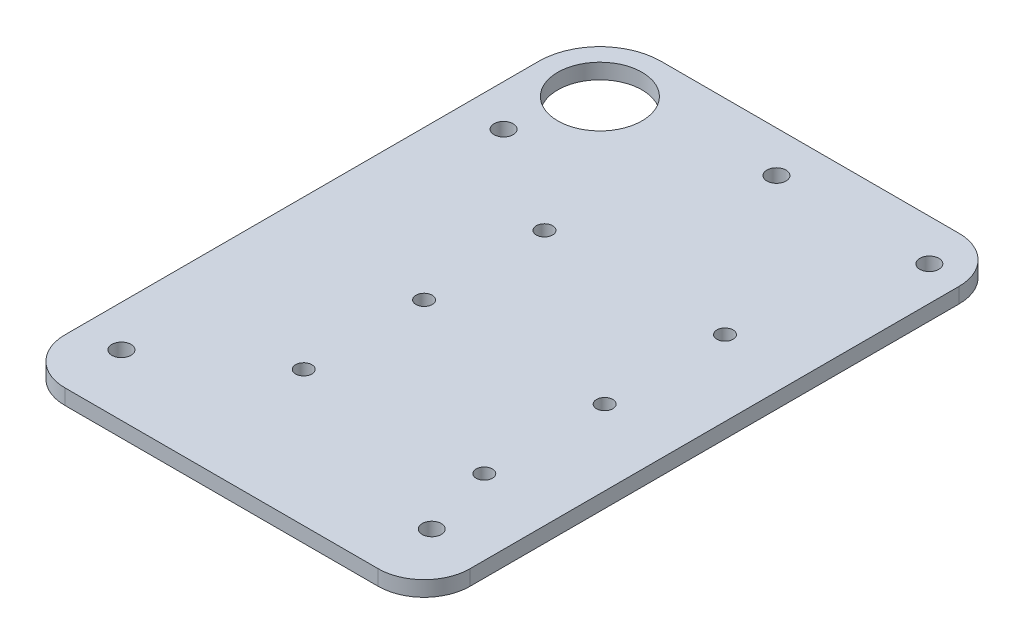
ISO-10303-21;
HEADER;
FILE_DESCRIPTION(('STEP AP214'),'2;1');
FILE_NAME('part.step','',(''),(''),'','','');
FILE_SCHEMA(('AUTOMOTIVE_DESIGN { 1 0 10303 214 1 1 1 1 }'));
ENDSEC;
DATA;
#1=APPLICATION_CONTEXT('core data for automotive mechanical design processes');
#2=APPLICATION_PROTOCOL_DEFINITION('international standard','automotive_design',2000,#1);
#3=PRODUCT_CONTEXT('',#1,'mechanical');
#4=PRODUCT('Part','Part','',(#3));
#5=PRODUCT_RELATED_PRODUCT_CATEGORY('part','',(#4));
#6=PRODUCT_DEFINITION_FORMATION('','',#4);
#7=PRODUCT_DEFINITION_CONTEXT('part definition',#1,'design');
#8=PRODUCT_DEFINITION('design','',#6,#7);
#9=PRODUCT_DEFINITION_SHAPE('','',#8);
#10=(LENGTH_UNIT() NAMED_UNIT(*) SI_UNIT(.MILLI.,.METRE.));
#11=(NAMED_UNIT(*) PLANE_ANGLE_UNIT() SI_UNIT($,.RADIAN.));
#12=(NAMED_UNIT(*) SI_UNIT($,.STERADIAN.) SOLID_ANGLE_UNIT());
#13=UNCERTAINTY_MEASURE_WITH_UNIT(LENGTH_MEASURE(1.E-05),#10,'distance_accuracy_value','');
#14=(GEOMETRIC_REPRESENTATION_CONTEXT(3) GLOBAL_UNCERTAINTY_ASSIGNED_CONTEXT((#13)) GLOBAL_UNIT_ASSIGNED_CONTEXT((#10,
#11,#12)) REPRESENTATION_CONTEXT('',''));
#15=CARTESIAN_POINT('',(0.,0.,0.));
#16=DIRECTION('',(0.,0.,1.));
#17=DIRECTION('',(1.,0.,0.));
#18=AXIS2_PLACEMENT_3D('',#15,#16,#17);
#19=CARTESIAN_POINT('',(0.,5.08,0.));
#20=DIRECTION('',(0.,-1.,0.));
#21=DIRECTION('',(0.,0.,-1.));
#22=AXIS2_PLACEMENT_3D('',#19,#20,#21);
#23=CYLINDRICAL_SURFACE('',#22,20.32);
#24=CARTESIAN_POINT('',(0.,0.,0.));
#25=DIRECTION('',(0.,1.,0.));
#26=DIRECTION('',(0.,0.,1.));
#27=AXIS2_PLACEMENT_3D('',#24,#25,#26);
#28=CIRCLE('',#27,20.32);
#29=CARTESIAN_POINT('',(0.,0.,-20.32));
#30=VERTEX_POINT('',#29);
#31=CARTESIAN_POINT('',(-20.32,0.,0.));
#32=VERTEX_POINT('',#31);
#33=EDGE_CURVE('E129',#30,#32,#28,.T.);
#34=ORIENTED_EDGE('',*,*,#33,.T.);
#35=DIRECTION('',(0.,-1.,0.));
#36=VECTOR('',#35,1.);
#37=CARTESIAN_POINT('',(-20.32,5.08,0.));
#38=LINE('',#37,#36);
#39=CARTESIAN_POINT('',(-20.32,5.08,0.));
#40=VERTEX_POINT('',#39);
#41=EDGE_CURVE('E112',#40,#32,#38,.T.);
#42=ORIENTED_EDGE('',*,*,#41,.F.);
#43=CARTESIAN_POINT('',(0.,5.08,0.));
#44=DIRECTION('',(0.,1.,0.));
#45=DIRECTION('',(0.,0.,1.));
#46=AXIS2_PLACEMENT_3D('',#43,#44,#45);
#47=CIRCLE('',#46,20.32);
#48=CARTESIAN_POINT('',(0.,5.08,-20.32));
#49=VERTEX_POINT('',#48);
#50=EDGE_CURVE('E116',#49,#40,#47,.T.);
#51=ORIENTED_EDGE('',*,*,#50,.F.);
#52=DIRECTION('',(0.,-1.,0.));
#53=VECTOR('',#52,1.);
#54=CARTESIAN_POINT('',(0.,5.08,-20.32));
#55=LINE('',#54,#53);
#56=EDGE_CURVE('E131',#49,#30,#55,.T.);
#57=ORIENTED_EDGE('',*,*,#56,.T.);
#58=EDGE_LOOP('',(#34,#42,#51,#57));
#59=FACE_BOUND('',#58,.T.);
#60=ADVANCED_FACE('F43',(#59),#23,.T.);
#61=CARTESIAN_POINT('',(-20.32,5.08,0.));
#62=DIRECTION('',(1.,0.,0.));
#63=DIRECTION('',(0.,0.,-1.));
#64=AXIS2_PLACEMENT_3D('',#61,#62,#63);
#65=PLANE('',#64);
#66=DIRECTION('',(0.,0.,1.));
#67=VECTOR('',#66,1.);
#68=CARTESIAN_POINT('',(-20.32,0.,0.));
#69=LINE('',#68,#67);
#70=CARTESIAN_POINT('',(-20.32,0.,157.48));
#71=VERTEX_POINT('',#70);
#72=EDGE_CURVE('E168',#32,#71,#69,.T.);
#73=ORIENTED_EDGE('',*,*,#72,.T.);
#74=DIRECTION('',(0.,-1.,0.));
#75=VECTOR('',#74,1.);
#76=CARTESIAN_POINT('',(-20.32,5.08,157.48));
#77=LINE('',#76,#75);
#78=CARTESIAN_POINT('',(-20.32,5.08,157.48));
#79=VERTEX_POINT('',#78);
#80=EDGE_CURVE('E11',#71,#79,#77,.F.);
#81=ORIENTED_EDGE('',*,*,#80,.T.);
#82=DIRECTION('',(0.,0.,1.));
#83=VECTOR('',#82,1.);
#84=CARTESIAN_POINT('',(-20.32,5.08,0.));
#85=LINE('',#84,#83);
#86=EDGE_CURVE('E107',#40,#79,#85,.T.);
#87=ORIENTED_EDGE('',*,*,#86,.F.);
#88=ORIENTED_EDGE('',*,*,#41,.T.);
#89=EDGE_LOOP('',(#73,#81,#87,#88));
#90=FACE_BOUND('',#89,.T.);
#91=ADVANCED_FACE('F110',(#90),#65,.F.);
#92=CARTESIAN_POINT('',(0.,5.08,172.72));
#93=DIRECTION('',(0.,0.,-1.));
#94=DIRECTION('',(-1.,0.,0.));
#95=AXIS2_PLACEMENT_3D('',#92,#93,#94);
#96=PLANE('',#95);
#97=DIRECTION('',(1.,0.,0.));
#98=VECTOR('',#97,1.);
#99=CARTESIAN_POINT('',(0.,0.,172.72));
#100=LINE('',#99,#98);
#101=CARTESIAN_POINT('',(-5.07999999999998,0.,172.72));
#102=VERTEX_POINT('',#101);
#103=CARTESIAN_POINT('',(99.06,0.,172.72));
#104=VERTEX_POINT('',#103);
#105=EDGE_CURVE('E160',#102,#104,#100,.T.);
#106=ORIENTED_EDGE('',*,*,#105,.T.);
#107=DIRECTION('',(0.,-1.,0.));
#108=VECTOR('',#107,1.);
#109=CARTESIAN_POINT('',(99.06,5.08,172.72));
#110=LINE('',#109,#108);
#111=CARTESIAN_POINT('',(99.06,5.08,172.72));
#112=VERTEX_POINT('',#111);
#113=EDGE_CURVE('E51',#104,#112,#110,.F.);
#114=ORIENTED_EDGE('',*,*,#113,.T.);
#115=DIRECTION('',(1.,0.,0.));
#116=VECTOR('',#115,1.);
#117=CARTESIAN_POINT('',(0.,5.08,172.72));
#118=LINE('',#117,#116);
#119=CARTESIAN_POINT('',(-5.07999999999998,5.08,172.72));
#120=VERTEX_POINT('',#119);
#121=EDGE_CURVE('E115',#120,#112,#118,.T.);
#122=ORIENTED_EDGE('',*,*,#121,.F.);
#123=DIRECTION('',(0.,-1.,0.));
#124=VECTOR('',#123,1.);
#125=CARTESIAN_POINT('',(-5.07999999999998,5.08,172.72));
#126=LINE('',#125,#124);
#127=EDGE_CURVE('E155',#120,#102,#126,.T.);
#128=ORIENTED_EDGE('',*,*,#127,.T.);
#129=EDGE_LOOP('',(#106,#114,#122,#128));
#130=FACE_BOUND('',#129,.T.);
#131=ADVANCED_FACE('F159',(#130),#96,.F.);
#132=CARTESIAN_POINT('',(114.3,5.08,0.));
#133=DIRECTION('',(1.,0.,0.));
#134=DIRECTION('',(0.,0.,-1.));
#135=AXIS2_PLACEMENT_3D('',#132,#133,#134);
#136=PLANE('',#135);
#137=DIRECTION('',(0.,0.,1.));
#138=VECTOR('',#137,1.);
#139=CARTESIAN_POINT('',(114.3,0.,0.));
#140=LINE('',#139,#138);
#141=CARTESIAN_POINT('',(114.3,0.,-5.08));
#142=VERTEX_POINT('',#141);
#143=CARTESIAN_POINT('',(114.3,0.,157.48));
#144=VERTEX_POINT('',#143);
#145=EDGE_CURVE('E167',#142,#144,#140,.T.);
#146=ORIENTED_EDGE('',*,*,#145,.F.);
#147=DIRECTION('',(0.,-1.,0.));
#148=VECTOR('',#147,1.);
#149=CARTESIAN_POINT('',(114.3,5.08,-5.08));
#150=LINE('',#149,#148);
#151=CARTESIAN_POINT('',(114.3,5.08,-5.08));
#152=VERTEX_POINT('',#151);
#153=EDGE_CURVE('E148',#142,#152,#150,.F.);
#154=ORIENTED_EDGE('',*,*,#153,.T.);
#155=DIRECTION('',(0.,0.,1.));
#156=VECTOR('',#155,1.);
#157=CARTESIAN_POINT('',(114.3,5.08,0.));
#158=LINE('',#157,#156);
#159=CARTESIAN_POINT('',(114.3,5.08,157.48));
#160=VERTEX_POINT('',#159);
#161=EDGE_CURVE('E215',#152,#160,#158,.T.);
#162=ORIENTED_EDGE('',*,*,#161,.T.);
#163=DIRECTION('',(0.,-1.,0.));
#164=VECTOR('',#163,1.);
#165=CARTESIAN_POINT('',(114.3,0.,157.48));
#166=LINE('',#165,#164);
#167=EDGE_CURVE('E145',#160,#144,#166,.T.);
#168=ORIENTED_EDGE('',*,*,#167,.T.);
#169=EDGE_LOOP('',(#146,#154,#162,#168));
#170=FACE_BOUND('',#169,.T.);
#171=ADVANCED_FACE('F282',(#170),#136,.T.);
#172=CARTESIAN_POINT('',(29.2978619093682,5.08,127.72));
#173=DIRECTION('',(0.,-1.,0.));
#174=DIRECTION('',(0.,0.,-1.));
#175=AXIS2_PLACEMENT_3D('',#172,#173,#174);
#176=CYLINDRICAL_SURFACE('',#175,2.7);
#177=CARTESIAN_POINT('',(29.2978619093682,5.08,127.72));
#178=DIRECTION('',(0.,1.,0.));
#179=DIRECTION('',(0.,0.,1.));
#180=AXIS2_PLACEMENT_3D('',#177,#178,#179);
#181=CIRCLE('',#180,2.7);
#182=CARTESIAN_POINT('',(29.2978619093682,5.08,130.42));
#183=VERTEX_POINT('',#182);
#184=EDGE_CURVE('E246',#183,#183,#181,.T.);
#185=ORIENTED_EDGE('',*,*,#184,.T.);
#186=EDGE_LOOP('',(#185));
#187=FACE_BOUND('',#186,.T.);
#188=CARTESIAN_POINT('',(29.2978619093682,0.,127.72));
#189=DIRECTION('',(0.,1.,0.));
#190=DIRECTION('',(0.,0.,1.));
#191=AXIS2_PLACEMENT_3D('',#188,#189,#190);
#192=CIRCLE('',#191,2.7);
#193=CARTESIAN_POINT('',(29.2978619093682,0.,130.42));
#194=VERTEX_POINT('',#193);
#195=EDGE_CURVE('E203',#194,#194,#192,.T.);
#196=ORIENTED_EDGE('',*,*,#195,.F.);
#197=EDGE_LOOP('',(#196));
#198=FACE_BOUND('',#197,.T.);
#199=ADVANCED_FACE('F284',(#187,#198),#176,.F.);
#200=CARTESIAN_POINT('',(89.2978619093682,5.08,127.72));
#201=DIRECTION('',(0.,-1.,0.));
#202=DIRECTION('',(0.,0.,-1.));
#203=AXIS2_PLACEMENT_3D('',#200,#201,#202);
#204=CYLINDRICAL_SURFACE('',#203,2.7);
#205=CARTESIAN_POINT('',(89.2978619093682,5.08,127.72));
#206=DIRECTION('',(0.,1.,0.));
#207=DIRECTION('',(0.,0.,1.));
#208=AXIS2_PLACEMENT_3D('',#205,#206,#207);
#209=CIRCLE('',#208,2.7);
#210=CARTESIAN_POINT('',(89.2978619093682,5.08,130.42));
#211=VERTEX_POINT('',#210);
#212=EDGE_CURVE('E243',#211,#211,#209,.T.);
#213=ORIENTED_EDGE('',*,*,#212,.T.);
#214=EDGE_LOOP('',(#213));
#215=FACE_BOUND('',#214,.T.);
#216=CARTESIAN_POINT('',(89.2978619093682,0.,127.72));
#217=DIRECTION('',(0.,1.,0.));
#218=DIRECTION('',(0.,0.,1.));
#219=AXIS2_PLACEMENT_3D('',#216,#217,#218);
#220=CIRCLE('',#219,2.7);
#221=CARTESIAN_POINT('',(89.2978619093682,0.,130.42));
#222=VERTEX_POINT('',#221);
#223=EDGE_CURVE('E200',#222,#222,#220,.T.);
#224=ORIENTED_EDGE('',*,*,#223,.F.);
#225=EDGE_LOOP('',(#224));
#226=FACE_BOUND('',#225,.T.);
#227=ADVANCED_FACE('F316',(#215,#226),#204,.F.);
#228=CARTESIAN_POINT('',(102.87,5.08,-6.604));
#229=DIRECTION('',(0.,-1.,0.));
#230=DIRECTION('',(0.,0.,-1.));
#231=AXIS2_PLACEMENT_3D('',#228,#229,#230);
#232=CYLINDRICAL_SURFACE('',#231,3.175);
#233=CARTESIAN_POINT('',(102.87,5.08,-6.604));
#234=DIRECTION('',(0.,1.,0.));
#235=DIRECTION('',(0.,0.,1.));
#236=AXIS2_PLACEMENT_3D('',#233,#234,#235);
#237=CIRCLE('',#236,3.175);
#238=CARTESIAN_POINT('',(102.87,5.08,-3.429));
#239=VERTEX_POINT('',#238);
#240=EDGE_CURVE('E240',#239,#239,#237,.T.);
#241=ORIENTED_EDGE('',*,*,#240,.T.);
#242=EDGE_LOOP('',(#241));
#243=FACE_BOUND('',#242,.T.);
#244=CARTESIAN_POINT('',(102.87,0.,-6.604));
#245=DIRECTION('',(0.,1.,0.));
#246=DIRECTION('',(0.,0.,1.));
#247=AXIS2_PLACEMENT_3D('',#244,#245,#246);
#248=CIRCLE('',#247,3.175);
#249=CARTESIAN_POINT('',(102.87,0.,-3.429));
#250=VERTEX_POINT('',#249);
#251=EDGE_CURVE('E197',#250,#250,#248,.T.);
#252=ORIENTED_EDGE('',*,*,#251,.F.);
#253=EDGE_LOOP('',(#252));
#254=FACE_BOUND('',#253,.T.);
#255=ADVANCED_FACE('F312',(#243,#254),#232,.F.);
#256=CARTESIAN_POINT('',(52.07,5.08,-6.604));
#257=DIRECTION('',(0.,-1.,0.));
#258=DIRECTION('',(0.,0.,-1.));
#259=AXIS2_PLACEMENT_3D('',#256,#257,#258);
#260=CYLINDRICAL_SURFACE('',#259,3.175);
#261=CARTESIAN_POINT('',(52.07,5.08,-6.604));
#262=DIRECTION('',(0.,1.,0.));
#263=DIRECTION('',(0.,0.,1.));
#264=AXIS2_PLACEMENT_3D('',#261,#262,#263);
#265=CIRCLE('',#264,3.175);
#266=CARTESIAN_POINT('',(52.07,5.08,-3.429));
#267=VERTEX_POINT('',#266);
#268=EDGE_CURVE('E237',#267,#267,#265,.T.);
#269=ORIENTED_EDGE('',*,*,#268,.T.);
#270=EDGE_LOOP('',(#269));
#271=FACE_BOUND('',#270,.T.);
#272=CARTESIAN_POINT('',(52.07,0.,-6.604));
#273=DIRECTION('',(0.,1.,0.));
#274=DIRECTION('',(0.,0.,1.));
#275=AXIS2_PLACEMENT_3D('',#272,#273,#274);
#276=CIRCLE('',#275,3.175);
#277=CARTESIAN_POINT('',(52.07,0.,-3.429));
#278=VERTEX_POINT('',#277);
#279=EDGE_CURVE('E194',#278,#278,#276,.T.);
#280=ORIENTED_EDGE('',*,*,#279,.F.);
#281=EDGE_LOOP('',(#280));
#282=FACE_BOUND('',#281,.T.);
#283=ADVANCED_FACE('F308',(#271,#282),#260,.F.);
#284=CARTESIAN_POINT('',(-6.60400000000001,5.08,25.4));
#285=DIRECTION('',(0.,-1.,0.));
#286=DIRECTION('',(0.,0.,-1.));
#287=AXIS2_PLACEMENT_3D('',#284,#285,#286);
#288=CYLINDRICAL_SURFACE('',#287,3.175);
#289=CARTESIAN_POINT('',(-6.60400000000001,5.08,25.4));
#290=DIRECTION('',(0.,1.,0.));
#291=DIRECTION('',(0.,0.,1.));
#292=AXIS2_PLACEMENT_3D('',#289,#290,#291);
#293=CIRCLE('',#292,3.175);
#294=CARTESIAN_POINT('',(-6.60400000000001,5.08,28.575));
#295=VERTEX_POINT('',#294);
#296=EDGE_CURVE('E234',#295,#295,#293,.T.);
#297=ORIENTED_EDGE('',*,*,#296,.T.);
#298=EDGE_LOOP('',(#297));
#299=FACE_BOUND('',#298,.T.);
#300=CARTESIAN_POINT('',(-6.60400000000001,0.,25.4));
#301=DIRECTION('',(0.,1.,0.));
#302=DIRECTION('',(0.,0.,1.));
#303=AXIS2_PLACEMENT_3D('',#300,#301,#302);
#304=CIRCLE('',#303,3.175);
#305=CARTESIAN_POINT('',(-6.60400000000001,0.,28.575));
#306=VERTEX_POINT('',#305);
#307=EDGE_CURVE('E191',#306,#306,#304,.T.);
#308=ORIENTED_EDGE('',*,*,#307,.F.);
#309=EDGE_LOOP('',(#308));
#310=FACE_BOUND('',#309,.T.);
#311=ADVANCED_FACE('F304',(#299,#310),#288,.F.);
#312=CARTESIAN_POINT('',(96.52,5.08,152.4));
#313=DIRECTION('',(0.,-1.,0.));
#314=DIRECTION('',(0.,0.,-1.));
#315=AXIS2_PLACEMENT_3D('',#312,#313,#314);
#316=CYLINDRICAL_SURFACE('',#315,3.175);
#317=CARTESIAN_POINT('',(96.52,5.08,152.4));
#318=DIRECTION('',(0.,1.,0.));
#319=DIRECTION('',(0.,0.,1.));
#320=AXIS2_PLACEMENT_3D('',#317,#318,#319);
#321=CIRCLE('',#320,3.175);
#322=CARTESIAN_POINT('',(96.52,5.08,155.575));
#323=VERTEX_POINT('',#322);
#324=EDGE_CURVE('E231',#323,#323,#321,.T.);
#325=ORIENTED_EDGE('',*,*,#324,.T.);
#326=EDGE_LOOP('',(#325));
#327=FACE_BOUND('',#326,.T.);
#328=CARTESIAN_POINT('',(96.52,0.,152.4));
#329=DIRECTION('',(0.,1.,0.));
#330=DIRECTION('',(0.,0.,1.));
#331=AXIS2_PLACEMENT_3D('',#328,#329,#330);
#332=CIRCLE('',#331,3.175);
#333=CARTESIAN_POINT('',(96.52,0.,155.575));
#334=VERTEX_POINT('',#333);
#335=EDGE_CURVE('E188',#334,#334,#332,.T.);
#336=ORIENTED_EDGE('',*,*,#335,.F.);
#337=EDGE_LOOP('',(#336));
#338=FACE_BOUND('',#337,.T.);
#339=ADVANCED_FACE('F300',(#327,#338),#316,.F.);
#340=CARTESIAN_POINT('',(29.2978619093682,5.08,87.72));
#341=DIRECTION('',(0.,-1.,0.));
#342=DIRECTION('',(0.,0.,-1.));
#343=AXIS2_PLACEMENT_3D('',#340,#341,#342);
#344=CYLINDRICAL_SURFACE('',#343,2.7);
#345=CARTESIAN_POINT('',(29.2978619093682,5.08,87.72));
#346=DIRECTION('',(0.,1.,0.));
#347=DIRECTION('',(0.,0.,1.));
#348=AXIS2_PLACEMENT_3D('',#345,#346,#347);
#349=CIRCLE('',#348,2.7);
#350=CARTESIAN_POINT('',(29.2978619093682,5.08,90.42));
#351=VERTEX_POINT('',#350);
#352=EDGE_CURVE('E228',#351,#351,#349,.T.);
#353=ORIENTED_EDGE('',*,*,#352,.T.);
#354=EDGE_LOOP('',(#353));
#355=FACE_BOUND('',#354,.T.);
#356=CARTESIAN_POINT('',(29.2978619093682,0.,87.72));
#357=DIRECTION('',(0.,1.,0.));
#358=DIRECTION('',(0.,0.,1.));
#359=AXIS2_PLACEMENT_3D('',#356,#357,#358);
#360=CIRCLE('',#359,2.7);
#361=CARTESIAN_POINT('',(29.2978619093682,0.,90.42));
#362=VERTEX_POINT('',#361);
#363=EDGE_CURVE('E185',#362,#362,#360,.T.);
#364=ORIENTED_EDGE('',*,*,#363,.F.);
#365=EDGE_LOOP('',(#364));
#366=FACE_BOUND('',#365,.T.);
#367=ADVANCED_FACE('F296',(#355,#366),#344,.F.);
#368=CARTESIAN_POINT('',(89.2978619093682,5.08,87.7199999999999));
#369=DIRECTION('',(0.,-1.,0.));
#370=DIRECTION('',(0.,0.,-1.));
#371=AXIS2_PLACEMENT_3D('',#368,#369,#370);
#372=CYLINDRICAL_SURFACE('',#371,2.7);
#373=CARTESIAN_POINT('',(89.2978619093682,5.08,87.7199999999999));
#374=DIRECTION('',(0.,1.,0.));
#375=DIRECTION('',(0.,0.,1.));
#376=AXIS2_PLACEMENT_3D('',#373,#374,#375);
#377=CIRCLE('',#376,2.7);
#378=CARTESIAN_POINT('',(89.2978619093682,5.08,90.4199999999999));
#379=VERTEX_POINT('',#378);
#380=EDGE_CURVE('E225',#379,#379,#377,.T.);
#381=ORIENTED_EDGE('',*,*,#380,.T.);
#382=EDGE_LOOP('',(#381));
#383=FACE_BOUND('',#382,.T.);
#384=CARTESIAN_POINT('',(89.2978619093682,0.,87.7199999999999));
#385=DIRECTION('',(0.,1.,0.));
#386=DIRECTION('',(0.,0.,1.));
#387=AXIS2_PLACEMENT_3D('',#384,#385,#386);
#388=CIRCLE('',#387,2.7);
#389=CARTESIAN_POINT('',(89.2978619093682,0.,90.4199999999999));
#390=VERTEX_POINT('',#389);
#391=EDGE_CURVE('E182',#390,#390,#388,.T.);
#392=ORIENTED_EDGE('',*,*,#391,.F.);
#393=EDGE_LOOP('',(#392));
#394=FACE_BOUND('',#393,.T.);
#395=ADVANCED_FACE('F292',(#383,#394),#372,.F.);
#396=CARTESIAN_POINT('',(29.2978619093682,5.08,47.72));
#397=DIRECTION('',(0.,-1.,0.));
#398=DIRECTION('',(0.,0.,-1.));
#399=AXIS2_PLACEMENT_3D('',#396,#397,#398);
#400=CYLINDRICAL_SURFACE('',#399,2.7);
#401=CARTESIAN_POINT('',(29.2978619093682,5.08,47.72));
#402=DIRECTION('',(0.,1.,0.));
#403=DIRECTION('',(0.,0.,1.));
#404=AXIS2_PLACEMENT_3D('',#401,#402,#403);
#405=CIRCLE('',#404,2.7);
#406=CARTESIAN_POINT('',(29.2978619093682,5.08,50.42));
#407=VERTEX_POINT('',#406);
#408=EDGE_CURVE('E222',#407,#407,#405,.T.);
#409=ORIENTED_EDGE('',*,*,#408,.T.);
#410=EDGE_LOOP('',(#409));
#411=FACE_BOUND('',#410,.T.);
#412=CARTESIAN_POINT('',(29.2978619093682,0.,47.72));
#413=DIRECTION('',(0.,1.,0.));
#414=DIRECTION('',(0.,0.,1.));
#415=AXIS2_PLACEMENT_3D('',#412,#413,#414);
#416=CIRCLE('',#415,2.7);
#417=CARTESIAN_POINT('',(29.2978619093682,0.,50.42));
#418=VERTEX_POINT('',#417);
#419=EDGE_CURVE('E179',#418,#418,#416,.T.);
#420=ORIENTED_EDGE('',*,*,#419,.F.);
#421=EDGE_LOOP('',(#420));
#422=FACE_BOUND('',#421,.T.);
#423=ADVANCED_FACE('F288',(#411,#422),#400,.F.);
#424=CARTESIAN_POINT('',(89.2978619093682,5.08,47.7199999999999));
#425=DIRECTION('',(0.,-1.,0.));
#426=DIRECTION('',(0.,0.,-1.));
#427=AXIS2_PLACEMENT_3D('',#424,#425,#426);
#428=CYLINDRICAL_SURFACE('',#427,2.7);
#429=CARTESIAN_POINT('',(89.2978619093682,5.08,47.7199999999999));
#430=DIRECTION('',(0.,1.,0.));
#431=DIRECTION('',(0.,0.,1.));
#432=AXIS2_PLACEMENT_3D('',#429,#430,#431);
#433=CIRCLE('',#432,2.7);
#434=CARTESIAN_POINT('',(89.2978619093682,5.08,50.4199999999999));
#435=VERTEX_POINT('',#434);
#436=EDGE_CURVE('E219',#435,#435,#433,.T.);
#437=ORIENTED_EDGE('',*,*,#436,.T.);
#438=EDGE_LOOP('',(#437));
#439=FACE_BOUND('',#438,.T.);
#440=CARTESIAN_POINT('',(89.2978619093682,0.,47.7199999999999));
#441=DIRECTION('',(0.,1.,0.));
#442=DIRECTION('',(0.,0.,1.));
#443=AXIS2_PLACEMENT_3D('',#440,#441,#442);
#444=CIRCLE('',#443,2.7);
#445=CARTESIAN_POINT('',(89.2978619093682,0.,50.4199999999999));
#446=VERTEX_POINT('',#445);
#447=EDGE_CURVE('E176',#446,#446,#444,.T.);
#448=ORIENTED_EDGE('',*,*,#447,.F.);
#449=EDGE_LOOP('',(#448));
#450=FACE_BOUND('',#449,.T.);
#451=ADVANCED_FACE('F268',(#439,#450),#428,.F.);
#452=CARTESIAN_POINT('',(0.,5.08,-20.32));
#453=DIRECTION('',(0.,0.,-1.));
#454=DIRECTION('',(-1.,0.,0.));
#455=AXIS2_PLACEMENT_3D('',#452,#453,#454);
#456=PLANE('',#455);
#457=DIRECTION('',(1.,0.,0.));
#458=VECTOR('',#457,1.);
#459=CARTESIAN_POINT('',(0.,5.08,-20.32));
#460=LINE('',#459,#458);
#461=CARTESIAN_POINT('',(99.06,5.08,-20.32));
#462=VERTEX_POINT('',#461);
#463=EDGE_CURVE('E124',#49,#462,#460,.T.);
#464=ORIENTED_EDGE('',*,*,#463,.T.);
#465=DIRECTION('',(0.,-1.,0.));
#466=VECTOR('',#465,1.);
#467=CARTESIAN_POINT('',(99.06,5.08,-20.32));
#468=LINE('',#467,#466);
#469=CARTESIAN_POINT('',(99.06,0.,-20.32));
#470=VERTEX_POINT('',#469);
#471=EDGE_CURVE('E130',#462,#470,#468,.T.);
#472=ORIENTED_EDGE('',*,*,#471,.T.);
#473=DIRECTION('',(1.,0.,0.));
#474=VECTOR('',#473,1.);
#475=CARTESIAN_POINT('',(0.,0.,-20.32));
#476=LINE('',#475,#474);
#477=EDGE_CURVE('E170',#30,#470,#476,.T.);
#478=ORIENTED_EDGE('',*,*,#477,.F.);
#479=ORIENTED_EDGE('',*,*,#56,.F.);
#480=EDGE_LOOP('',(#464,#472,#478,#479));
#481=FACE_BOUND('',#480,.T.);
#482=ADVANCED_FACE('F259',(#481),#456,.T.);
#483=CARTESIAN_POINT('',(0.,5.08,0.));
#484=DIRECTION('',(0.,-1.,0.));
#485=DIRECTION('',(0.,0.,-1.));
#486=AXIS2_PLACEMENT_3D('',#483,#484,#485);
#487=CYLINDRICAL_SURFACE('',#486,14.);
#488=CARTESIAN_POINT('',(0.,5.08,0.));
#489=DIRECTION('',(0.,1.,0.));
#490=DIRECTION('',(0.,0.,1.));
#491=AXIS2_PLACEMENT_3D('',#488,#489,#490);
#492=CIRCLE('',#491,14.);
#493=CARTESIAN_POINT('',(0.,5.08,14.));
#494=VERTEX_POINT('',#493);
#495=EDGE_CURVE('E126',#494,#494,#492,.T.);
#496=ORIENTED_EDGE('',*,*,#495,.T.);
#497=EDGE_LOOP('',(#496));
#498=FACE_BOUND('',#497,.T.);
#499=CARTESIAN_POINT('',(0.,0.,0.));
#500=DIRECTION('',(0.,1.,0.));
#501=DIRECTION('',(0.,0.,1.));
#502=AXIS2_PLACEMENT_3D('',#499,#500,#501);
#503=CIRCLE('',#502,14.);
#504=CARTESIAN_POINT('',(0.,0.,14.));
#505=VERTEX_POINT('',#504);
#506=EDGE_CURVE('E251',#505,#505,#503,.T.);
#507=ORIENTED_EDGE('',*,*,#506,.F.);
#508=EDGE_LOOP('',(#507));
#509=FACE_BOUND('',#508,.T.);
#510=ADVANCED_FACE('F256',(#498,#509),#487,.F.);
#511=CARTESIAN_POINT('',(-6.604,5.08,152.4));
#512=DIRECTION('',(0.,-1.,0.));
#513=DIRECTION('',(0.,0.,-1.));
#514=AXIS2_PLACEMENT_3D('',#511,#512,#513);
#515=CYLINDRICAL_SURFACE('',#514,3.175);
#516=CARTESIAN_POINT('',(-6.604,5.08,152.4));
#517=DIRECTION('',(0.,1.,0.));
#518=DIRECTION('',(0.,0.,1.));
#519=AXIS2_PLACEMENT_3D('',#516,#517,#518);
#520=CIRCLE('',#519,3.175);
#521=CARTESIAN_POINT('',(-6.604,5.08,155.575));
#522=VERTEX_POINT('',#521);
#523=EDGE_CURVE('E136',#522,#522,#520,.T.);
#524=ORIENTED_EDGE('',*,*,#523,.T.);
#525=EDGE_LOOP('',(#524));
#526=FACE_BOUND('',#525,.T.);
#527=CARTESIAN_POINT('',(-6.604,0.,152.4));
#528=DIRECTION('',(0.,1.,0.));
#529=DIRECTION('',(0.,0.,1.));
#530=AXIS2_PLACEMENT_3D('',#527,#528,#529);
#531=CIRCLE('',#530,3.175);
#532=CARTESIAN_POINT('',(-6.604,0.,155.575));
#533=VERTEX_POINT('',#532);
#534=EDGE_CURVE('E205',#533,#533,#531,.T.);
#535=ORIENTED_EDGE('',*,*,#534,.F.);
#536=EDGE_LOOP('',(#535));
#537=FACE_BOUND('',#536,.T.);
#538=ADVANCED_FACE('F258',(#526,#537),#515,.F.);
#539=CARTESIAN_POINT('',(0.,5.08,0.));
#540=DIRECTION('',(0.,1.,0.));
#541=DIRECTION('',(0.,0.,1.));
#542=AXIS2_PLACEMENT_3D('',#539,#540,#541);
#543=PLANE('',#542);
#544=ORIENTED_EDGE('',*,*,#495,.F.);
#545=EDGE_LOOP('',(#544));
#546=FACE_BOUND('',#545,.T.);
#547=ORIENTED_EDGE('',*,*,#161,.F.);
#548=CARTESIAN_POINT('',(99.06,5.08,-5.08));
#549=DIRECTION('',(0.,1.,0.));
#550=DIRECTION('',(0.,0.,1.));
#551=AXIS2_PLACEMENT_3D('',#548,#549,#550);
#552=CIRCLE('',#551,15.24);
#553=EDGE_CURVE('E153',#152,#462,#552,.T.);
#554=ORIENTED_EDGE('',*,*,#553,.T.);
#555=ORIENTED_EDGE('',*,*,#463,.F.);
#556=ORIENTED_EDGE('',*,*,#50,.T.);
#557=ORIENTED_EDGE('',*,*,#86,.T.);
#558=CARTESIAN_POINT('',(-5.07999999999998,5.08,157.48));
#559=DIRECTION('',(0.,1.,0.));
#560=DIRECTION('',(0.,0.,1.));
#561=AXIS2_PLACEMENT_3D('',#558,#559,#560);
#562=CIRCLE('',#561,15.24);
#563=EDGE_CURVE('E64',#79,#120,#562,.T.);
#564=ORIENTED_EDGE('',*,*,#563,.T.);
#565=ORIENTED_EDGE('',*,*,#121,.T.);
#566=CARTESIAN_POINT('',(99.06,5.08,157.48));
#567=DIRECTION('',(0.,1.,0.));
#568=DIRECTION('',(0.,0.,1.));
#569=AXIS2_PLACEMENT_3D('',#566,#567,#568);
#570=CIRCLE('',#569,15.24);
#571=EDGE_CURVE('E151',#112,#160,#570,.T.);
#572=ORIENTED_EDGE('',*,*,#571,.T.);
#573=EDGE_LOOP('',(#547,#554,#555,#556,#557,#564,#565,#572));
#574=FACE_BOUND('',#573,.T.);
#575=ORIENTED_EDGE('',*,*,#436,.F.);
#576=EDGE_LOOP('',(#575));
#577=FACE_BOUND('',#576,.T.);
#578=ORIENTED_EDGE('',*,*,#408,.F.);
#579=EDGE_LOOP('',(#578));
#580=FACE_BOUND('',#579,.T.);
#581=ORIENTED_EDGE('',*,*,#380,.F.);
#582=EDGE_LOOP('',(#581));
#583=FACE_BOUND('',#582,.T.);
#584=ORIENTED_EDGE('',*,*,#352,.F.);
#585=EDGE_LOOP('',(#584));
#586=FACE_BOUND('',#585,.T.);
#587=ORIENTED_EDGE('',*,*,#324,.F.);
#588=EDGE_LOOP('',(#587));
#589=FACE_BOUND('',#588,.T.);
#590=ORIENTED_EDGE('',*,*,#296,.F.);
#591=EDGE_LOOP('',(#590));
#592=FACE_BOUND('',#591,.T.);
#593=ORIENTED_EDGE('',*,*,#268,.F.);
#594=EDGE_LOOP('',(#593));
#595=FACE_BOUND('',#594,.T.);
#596=ORIENTED_EDGE('',*,*,#240,.F.);
#597=EDGE_LOOP('',(#596));
#598=FACE_BOUND('',#597,.T.);
#599=ORIENTED_EDGE('',*,*,#212,.F.);
#600=EDGE_LOOP('',(#599));
#601=FACE_BOUND('',#600,.T.);
#602=ORIENTED_EDGE('',*,*,#184,.F.);
#603=EDGE_LOOP('',(#602));
#604=FACE_BOUND('',#603,.T.);
#605=ORIENTED_EDGE('',*,*,#523,.F.);
#606=EDGE_LOOP('',(#605));
#607=FACE_BOUND('',#606,.T.);
#608=ADVANCED_FACE('F121',(#546,#574,#577,#580,#583,#586,#589,#592,#595,#598,#601,#604,#607),
#543,.T.);
#609=CARTESIAN_POINT('',(0.,0.,0.));
#610=DIRECTION('',(0.,1.,0.));
#611=DIRECTION('',(0.,0.,1.));
#612=AXIS2_PLACEMENT_3D('',#609,#610,#611);
#613=PLANE('',#612);
#614=ORIENTED_EDGE('',*,*,#506,.T.);
#615=EDGE_LOOP('',(#614));
#616=FACE_BOUND('',#615,.T.);
#617=ORIENTED_EDGE('',*,*,#477,.T.);
#618=CARTESIAN_POINT('',(99.06,0.,-5.08));
#619=DIRECTION('',(0.,1.,0.));
#620=DIRECTION('',(0.,0.,1.));
#621=AXIS2_PLACEMENT_3D('',#618,#619,#620);
#622=CIRCLE('',#621,15.24);
#623=EDGE_CURVE('E143',#470,#142,#622,.F.);
#624=ORIENTED_EDGE('',*,*,#623,.T.);
#625=ORIENTED_EDGE('',*,*,#145,.T.);
#626=CARTESIAN_POINT('',(99.06,0.,157.48));
#627=DIRECTION('',(0.,1.,0.));
#628=DIRECTION('',(0.,0.,1.));
#629=AXIS2_PLACEMENT_3D('',#626,#627,#628);
#630=CIRCLE('',#629,15.24);
#631=EDGE_CURVE('E141',#144,#104,#630,.F.);
#632=ORIENTED_EDGE('',*,*,#631,.T.);
#633=ORIENTED_EDGE('',*,*,#105,.F.);
#634=CARTESIAN_POINT('',(-5.07999999999998,0.,157.48));
#635=DIRECTION('',(0.,1.,0.));
#636=DIRECTION('',(0.,0.,1.));
#637=AXIS2_PLACEMENT_3D('',#634,#635,#636);
#638=CIRCLE('',#637,15.24);
#639=EDGE_CURVE('E134',#102,#71,#638,.F.);
#640=ORIENTED_EDGE('',*,*,#639,.T.);
#641=ORIENTED_EDGE('',*,*,#72,.F.);
#642=ORIENTED_EDGE('',*,*,#33,.F.);
#643=EDGE_LOOP('',(#617,#624,#625,#632,#633,#640,#641,#642));
#644=FACE_BOUND('',#643,.T.);
#645=ORIENTED_EDGE('',*,*,#447,.T.);
#646=EDGE_LOOP('',(#645));
#647=FACE_BOUND('',#646,.T.);
#648=ORIENTED_EDGE('',*,*,#419,.T.);
#649=EDGE_LOOP('',(#648));
#650=FACE_BOUND('',#649,.T.);
#651=ORIENTED_EDGE('',*,*,#391,.T.);
#652=EDGE_LOOP('',(#651));
#653=FACE_BOUND('',#652,.T.);
#654=ORIENTED_EDGE('',*,*,#363,.T.);
#655=EDGE_LOOP('',(#654));
#656=FACE_BOUND('',#655,.T.);
#657=ORIENTED_EDGE('',*,*,#335,.T.);
#658=EDGE_LOOP('',(#657));
#659=FACE_BOUND('',#658,.T.);
#660=ORIENTED_EDGE('',*,*,#307,.T.);
#661=EDGE_LOOP('',(#660));
#662=FACE_BOUND('',#661,.T.);
#663=ORIENTED_EDGE('',*,*,#279,.T.);
#664=EDGE_LOOP('',(#663));
#665=FACE_BOUND('',#664,.T.);
#666=ORIENTED_EDGE('',*,*,#251,.T.);
#667=EDGE_LOOP('',(#666));
#668=FACE_BOUND('',#667,.T.);
#669=ORIENTED_EDGE('',*,*,#223,.T.);
#670=EDGE_LOOP('',(#669));
#671=FACE_BOUND('',#670,.T.);
#672=ORIENTED_EDGE('',*,*,#195,.T.);
#673=EDGE_LOOP('',(#672));
#674=FACE_BOUND('',#673,.T.);
#675=ORIENTED_EDGE('',*,*,#534,.T.);
#676=EDGE_LOOP('',(#675));
#677=FACE_BOUND('',#676,.T.);
#678=ADVANCED_FACE('F164',(#616,#644,#647,#650,#653,#656,#659,#662,#665,#668,#671,#674,#677),
#613,.F.);
#679=CARTESIAN_POINT('',(99.06,5.08,-5.08));
#680=DIRECTION('',(0.,-1.,0.));
#681=DIRECTION('',(0.,0.,-1.));
#682=AXIS2_PLACEMENT_3D('',#679,#680,#681);
#683=CYLINDRICAL_SURFACE('',#682,15.24);
#684=ORIENTED_EDGE('',*,*,#553,.F.);
#685=ORIENTED_EDGE('',*,*,#153,.F.);
#686=ORIENTED_EDGE('',*,*,#623,.F.);
#687=ORIENTED_EDGE('',*,*,#471,.F.);
#688=EDGE_LOOP('',(#684,#685,#686,#687));
#689=FACE_BOUND('',#688,.T.);
#690=ADVANCED_FACE('F325',(#689),#683,.T.);
#691=CARTESIAN_POINT('',(99.06,5.08,157.48));
#692=DIRECTION('',(0.,1.,0.));
#693=DIRECTION('',(0.,0.,1.));
#694=AXIS2_PLACEMENT_3D('',#691,#692,#693);
#695=CYLINDRICAL_SURFACE('',#694,15.24);
#696=ORIENTED_EDGE('',*,*,#571,.F.);
#697=ORIENTED_EDGE('',*,*,#113,.F.);
#698=ORIENTED_EDGE('',*,*,#631,.F.);
#699=ORIENTED_EDGE('',*,*,#167,.F.);
#700=EDGE_LOOP('',(#696,#697,#698,#699));
#701=FACE_BOUND('',#700,.T.);
#702=ADVANCED_FACE('F344',(#701),#695,.T.);
#703=CARTESIAN_POINT('',(-5.07999999999998,5.08,157.48));
#704=DIRECTION('',(0.,-1.,0.));
#705=DIRECTION('',(0.,0.,-1.));
#706=AXIS2_PLACEMENT_3D('',#703,#704,#705);
#707=CYLINDRICAL_SURFACE('',#706,15.24);
#708=ORIENTED_EDGE('',*,*,#563,.F.);
#709=ORIENTED_EDGE('',*,*,#80,.F.);
#710=ORIENTED_EDGE('',*,*,#639,.F.);
#711=ORIENTED_EDGE('',*,*,#127,.F.);
#712=EDGE_LOOP('',(#708,#709,#710,#711));
#713=FACE_BOUND('',#712,.T.);
#714=ADVANCED_FACE('F45',(#713),#707,.T.);
#715=CLOSED_SHELL('',(#60,#91,#131,#171,#199,#227,#255,#283,#311,#339,#367,#395,#423,#451,#482,
#510,#538,#608,#678,#690,#702,#714));
#716=MANIFOLD_SOLID_BREP('B2',#715);
#717=ADVANCED_BREP_SHAPE_REPRESENTATION('',(#18,#716),#14);
#718=SHAPE_DEFINITION_REPRESENTATION(#9,#717);
ENDSEC;
END-ISO-10303-21;
